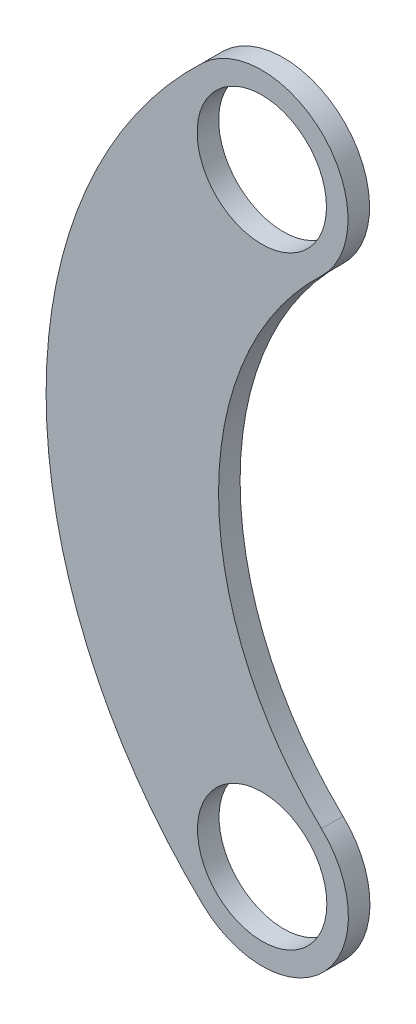
ISO-10303-21;
HEADER;
FILE_DESCRIPTION(('STEP AP214'),'2;1');
FILE_NAME('part.step','',(''),(''),'','','');
FILE_SCHEMA(('AUTOMOTIVE_DESIGN { 1 0 10303 214 1 1 1 1 }'));
ENDSEC;
DATA;
#1=APPLICATION_CONTEXT('core data for automotive mechanical design processes');
#2=APPLICATION_PROTOCOL_DEFINITION('international standard','automotive_design',2000,#1);
#3=PRODUCT_CONTEXT('',#1,'mechanical');
#4=PRODUCT('Part','Part','',(#3));
#5=PRODUCT_RELATED_PRODUCT_CATEGORY('part','',(#4));
#6=PRODUCT_DEFINITION_FORMATION('','',#4);
#7=PRODUCT_DEFINITION_CONTEXT('part definition',#1,'design');
#8=PRODUCT_DEFINITION('design','',#6,#7);
#9=PRODUCT_DEFINITION_SHAPE('','',#8);
#10=(LENGTH_UNIT() NAMED_UNIT(*) SI_UNIT(.MILLI.,.METRE.));
#11=(NAMED_UNIT(*) PLANE_ANGLE_UNIT() SI_UNIT($,.RADIAN.));
#12=(NAMED_UNIT(*) SI_UNIT($,.STERADIAN.) SOLID_ANGLE_UNIT());
#13=UNCERTAINTY_MEASURE_WITH_UNIT(LENGTH_MEASURE(1.E-05),#10,'distance_accuracy_value','');
#14=(GEOMETRIC_REPRESENTATION_CONTEXT(3) GLOBAL_UNCERTAINTY_ASSIGNED_CONTEXT((#13)) GLOBAL_UNIT_ASSIGNED_CONTEXT((#10,
#11,#12)) REPRESENTATION_CONTEXT('',''));
#15=CARTESIAN_POINT('',(0.,0.,0.));
#16=DIRECTION('',(0.,0.,1.));
#17=DIRECTION('',(1.,0.,0.));
#18=AXIS2_PLACEMENT_3D('',#15,#16,#17);
#19=CARTESIAN_POINT('',(-31.7651022120724,-5.87017847864853,-1.));
#20=DIRECTION('',(0.,0.,1.));
#21=DIRECTION('',(1.,0.,0.));
#22=AXIS2_PLACEMENT_3D('',#19,#20,#21);
#23=CYLINDRICAL_SURFACE('',#22,4.);
#24=CARTESIAN_POINT('',(-31.7651022120724,-5.87017847864853,0.));
#25=DIRECTION('',(0.,0.,1.));
#26=DIRECTION('',(1.,0.,0.));
#27=AXIS2_PLACEMENT_3D('',#24,#25,#26);
#28=CIRCLE('',#27,4.);
#29=CARTESIAN_POINT('',(-29.0099737146953,-8.77005209019454,0.));
#30=VERTEX_POINT('',#29);
#31=CARTESIAN_POINT('',(-34.5202307094494,-2.97030486710253,0.));
#32=VERTEX_POINT('',#31);
#33=EDGE_CURVE('E104',#30,#32,#28,.T.);
#34=ORIENTED_EDGE('',*,*,#33,.F.);
#35=DIRECTION('',(0.,0.,1.));
#36=VECTOR('',#35,1.);
#37=CARTESIAN_POINT('',(-29.0099737146953,-8.77005209019454,-1.));
#38=LINE('',#37,#36);
#39=CARTESIAN_POINT('',(-29.0099737146953,-8.77005209019454,-1.));
#40=VERTEX_POINT('',#39);
#41=EDGE_CURVE('E11',#40,#30,#38,.T.);
#42=ORIENTED_EDGE('',*,*,#41,.F.);
#43=CARTESIAN_POINT('',(-31.7651022120724,-5.87017847864853,-1.));
#44=DIRECTION('',(0.,0.,1.));
#45=DIRECTION('',(1.,0.,0.));
#46=AXIS2_PLACEMENT_3D('',#43,#44,#45);
#47=CIRCLE('',#46,4.);
#48=CARTESIAN_POINT('',(-34.5202307094494,-2.97030486710253,-1.));
#49=VERTEX_POINT('',#48);
#50=EDGE_CURVE('E97',#40,#49,#47,.T.);
#51=ORIENTED_EDGE('',*,*,#50,.T.);
#52=DIRECTION('',(0.,0.,1.));
#53=VECTOR('',#52,1.);
#54=CARTESIAN_POINT('',(-34.5202307094494,-2.97030486710253,-1.));
#55=LINE('',#54,#53);
#56=EDGE_CURVE('E42',#49,#32,#55,.T.);
#57=ORIENTED_EDGE('',*,*,#56,.T.);
#58=EDGE_LOOP('',(#34,#42,#51,#57));
#59=FACE_BOUND('',#58,.T.);
#60=ADVANCED_FACE('F39',(#59),#23,.T.);
#61=CARTESIAN_POINT('',(-18.4716072122281,-19.862068654358,-1.));
#62=DIRECTION('',(0.,0.,1.));
#63=DIRECTION('',(1.,0.,0.));
#64=AXIS2_PLACEMENT_3D('',#61,#62,#63);
#65=CYLINDRICAL_SURFACE('',#64,15.3);
#66=CARTESIAN_POINT('',(-18.4716072122281,-19.862068654358,0.));
#67=DIRECTION('',(0.,0.,-1.));
#68=DIRECTION('',(1.,0.,0.));
#69=AXIS2_PLACEMENT_3D('',#66,#67,#68);
#70=CIRCLE('',#69,15.3);
#71=CARTESIAN_POINT('',(-28.9964279377155,-30.9669391487109,0.));
#72=VERTEX_POINT('',#71);
#73=EDGE_CURVE('E99',#72,#30,#70,.T.);
#74=ORIENTED_EDGE('',*,*,#73,.F.);
#75=DIRECTION('',(0.,0.,1.));
#76=VECTOR('',#75,1.);
#77=CARTESIAN_POINT('',(-28.9964279377155,-30.9669391487109,-1.));
#78=LINE('',#77,#76);
#79=CARTESIAN_POINT('',(-28.9964279377155,-30.9669391487109,-1.));
#80=VERTEX_POINT('',#79);
#81=EDGE_CURVE('E48',#80,#72,#78,.T.);
#82=ORIENTED_EDGE('',*,*,#81,.F.);
#83=CARTESIAN_POINT('',(-18.4716072122281,-19.862068654358,-1.));
#84=DIRECTION('',(0.,0.,-1.));
#85=DIRECTION('',(1.,0.,0.));
#86=AXIS2_PLACEMENT_3D('',#83,#84,#85);
#87=CIRCLE('',#86,15.3);
#88=EDGE_CURVE('E94',#80,#40,#87,.T.);
#89=ORIENTED_EDGE('',*,*,#88,.T.);
#90=ORIENTED_EDGE('',*,*,#41,.T.);
#91=EDGE_LOOP('',(#74,#82,#89,#90));
#92=FACE_BOUND('',#91,.T.);
#93=ADVANCED_FACE('F115',(#92),#65,.F.);
#94=CARTESIAN_POINT('',(-31.74801505549,-33.8701732648816,-1.));
#95=DIRECTION('',(0.,0.,1.));
#96=DIRECTION('',(1.,0.,0.));
#97=AXIS2_PLACEMENT_3D('',#94,#95,#96);
#98=CYLINDRICAL_SURFACE('',#97,4.00000000000001);
#99=CARTESIAN_POINT('',(-31.74801505549,-33.8701732648816,0.));
#100=DIRECTION('',(0.,0.,1.));
#101=DIRECTION('',(1.,0.,0.));
#102=AXIS2_PLACEMENT_3D('',#99,#100,#101);
#103=CIRCLE('',#102,4.00000000000001);
#104=CARTESIAN_POINT('',(-34.4996021732645,-36.7734073810523,0.));
#105=VERTEX_POINT('',#104);
#106=EDGE_CURVE('E89',#105,#72,#103,.T.);
#107=ORIENTED_EDGE('',*,*,#106,.F.);
#108=DIRECTION('',(0.,0.,1.));
#109=VECTOR('',#108,1.);
#110=CARTESIAN_POINT('',(-34.4996021732645,-36.7734073810523,-1.));
#111=LINE('',#110,#109);
#112=CARTESIAN_POINT('',(-34.4996021732645,-36.7734073810523,-1.));
#113=VERTEX_POINT('',#112);
#114=EDGE_CURVE('E84',#113,#105,#111,.T.);
#115=ORIENTED_EDGE('',*,*,#114,.F.);
#116=CARTESIAN_POINT('',(-31.74801505549,-33.8701732648816,-1.));
#117=DIRECTION('',(0.,0.,1.));
#118=DIRECTION('',(1.,0.,0.));
#119=AXIS2_PLACEMENT_3D('',#116,#117,#118);
#120=CIRCLE('',#119,4.00000000000001);
#121=EDGE_CURVE('E87',#113,#80,#120,.T.);
#122=ORIENTED_EDGE('',*,*,#121,.T.);
#123=ORIENTED_EDGE('',*,*,#81,.T.);
#124=EDGE_LOOP('',(#107,#115,#122,#123));
#125=FACE_BOUND('',#124,.T.);
#126=ADVANCED_FACE('F86',(#125),#98,.T.);
#127=CARTESIAN_POINT('',(-18.4716072122281,-19.862068654358,-1.));
#128=DIRECTION('',(0.,0.,1.));
#129=DIRECTION('',(1.,0.,0.));
#130=AXIS2_PLACEMENT_3D('',#127,#128,#129);
#131=CYLINDRICAL_SURFACE('',#130,23.3);
#132=CARTESIAN_POINT('',(-18.4716072122281,-19.862068654358,0.));
#133=DIRECTION('',(0.,0.,1.));
#134=DIRECTION('',(1.,0.,0.));
#135=AXIS2_PLACEMENT_3D('',#132,#133,#134);
#136=CIRCLE('',#135,23.3);
#137=EDGE_CURVE('E107',#32,#105,#136,.T.);
#138=ORIENTED_EDGE('',*,*,#137,.F.);
#139=ORIENTED_EDGE('',*,*,#56,.F.);
#140=CARTESIAN_POINT('',(-18.4716072122281,-19.862068654358,-1.));
#141=DIRECTION('',(0.,0.,1.));
#142=DIRECTION('',(1.,0.,0.));
#143=AXIS2_PLACEMENT_3D('',#140,#141,#142);
#144=CIRCLE('',#143,23.3);
#145=EDGE_CURVE('E93',#49,#113,#144,.T.);
#146=ORIENTED_EDGE('',*,*,#145,.T.);
#147=ORIENTED_EDGE('',*,*,#114,.T.);
#148=EDGE_LOOP('',(#138,#139,#146,#147));
#149=FACE_BOUND('',#148,.T.);
#150=ADVANCED_FACE('F96',(#149),#131,.T.);
#151=CARTESIAN_POINT('',(-25.1183547121502,-12.8661235665033,-1.));
#152=DIRECTION('',(0.,0.,1.));
#153=DIRECTION('',(1.,0.,0.));
#154=AXIS2_PLACEMENT_3D('',#151,#152,#153);
#155=PLANE('',#154);
#156=CARTESIAN_POINT('',(-31.7651022120724,-5.87017847864853,-1.));
#157=DIRECTION('',(0.,0.,1.));
#158=DIRECTION('',(1.,0.,0.));
#159=AXIS2_PLACEMENT_3D('',#156,#157,#158);
#160=CIRCLE('',#159,3.00000000000001);
#161=CARTESIAN_POINT('',(-28.7651022120724,-5.87017847864853,-1.));
#162=VERTEX_POINT('',#161);
#163=EDGE_CURVE('E148',#162,#162,#160,.T.);
#164=ORIENTED_EDGE('',*,*,#163,.T.);
#165=EDGE_LOOP('',(#164));
#166=FACE_BOUND('',#165,.T.);
#167=CARTESIAN_POINT('',(-31.74801505549,-33.8701732648816,-1.));
#168=DIRECTION('',(0.,0.,1.));
#169=DIRECTION('',(1.,0.,0.));
#170=AXIS2_PLACEMENT_3D('',#167,#168,#169);
#171=CIRCLE('',#170,3.00000000000001);
#172=CARTESIAN_POINT('',(-28.74801505549,-33.8701732648816,-1.));
#173=VERTEX_POINT('',#172);
#174=EDGE_CURVE('E108',#173,#173,#171,.T.);
#175=ORIENTED_EDGE('',*,*,#174,.T.);
#176=EDGE_LOOP('',(#175));
#177=FACE_BOUND('',#176,.T.);
#178=ORIENTED_EDGE('',*,*,#50,.F.);
#179=ORIENTED_EDGE('',*,*,#88,.F.);
#180=ORIENTED_EDGE('',*,*,#121,.F.);
#181=ORIENTED_EDGE('',*,*,#145,.F.);
#182=EDGE_LOOP('',(#178,#179,#180,#181));
#183=FACE_BOUND('',#182,.T.);
#184=ADVANCED_FACE('F92',(#166,#177,#183),#155,.F.);
#185=CARTESIAN_POINT('',(-25.1183547121502,-12.8661235665033,0.));
#186=DIRECTION('',(0.,0.,1.));
#187=DIRECTION('',(1.,0.,0.));
#188=AXIS2_PLACEMENT_3D('',#185,#186,#187);
#189=PLANE('',#188);
#190=CARTESIAN_POINT('',(-31.7651022120724,-5.87017847864853,0.));
#191=DIRECTION('',(0.,0.,1.));
#192=DIRECTION('',(1.,0.,0.));
#193=AXIS2_PLACEMENT_3D('',#190,#191,#192);
#194=CIRCLE('',#193,3.00000000000001);
#195=CARTESIAN_POINT('',(-28.7651022120724,-5.87017847864853,0.));
#196=VERTEX_POINT('',#195);
#197=EDGE_CURVE('E151',#196,#196,#194,.T.);
#198=ORIENTED_EDGE('',*,*,#197,.F.);
#199=EDGE_LOOP('',(#198));
#200=FACE_BOUND('',#199,.T.);
#201=CARTESIAN_POINT('',(-31.74801505549,-33.8701732648816,0.));
#202=DIRECTION('',(0.,0.,1.));
#203=DIRECTION('',(1.,0.,0.));
#204=AXIS2_PLACEMENT_3D('',#201,#202,#203);
#205=CIRCLE('',#204,3.00000000000001);
#206=CARTESIAN_POINT('',(-28.74801505549,-33.8701732648816,0.));
#207=VERTEX_POINT('',#206);
#208=EDGE_CURVE('E153',#207,#207,#205,.T.);
#209=ORIENTED_EDGE('',*,*,#208,.F.);
#210=EDGE_LOOP('',(#209));
#211=FACE_BOUND('',#210,.T.);
#212=ORIENTED_EDGE('',*,*,#33,.T.);
#213=ORIENTED_EDGE('',*,*,#137,.T.);
#214=ORIENTED_EDGE('',*,*,#106,.T.);
#215=ORIENTED_EDGE('',*,*,#73,.T.);
#216=EDGE_LOOP('',(#212,#213,#214,#215));
#217=FACE_BOUND('',#216,.T.);
#218=ADVANCED_FACE('F114',(#200,#211,#217),#189,.T.);
#219=CARTESIAN_POINT('',(-31.74801505549,-33.8701732648816,-1.));
#220=DIRECTION('',(0.,0.,1.));
#221=DIRECTION('',(1.,0.,0.));
#222=AXIS2_PLACEMENT_3D('',#219,#220,#221);
#223=CYLINDRICAL_SURFACE('',#222,3.00000000000001);
#224=ORIENTED_EDGE('',*,*,#174,.F.);
#225=EDGE_LOOP('',(#224));
#226=FACE_BOUND('',#225,.T.);
#227=ORIENTED_EDGE('',*,*,#208,.T.);
#228=EDGE_LOOP('',(#227));
#229=FACE_BOUND('',#228,.T.);
#230=ADVANCED_FACE('F133',(#226,#229),#223,.F.);
#231=CARTESIAN_POINT('',(-31.7651022120724,-5.87017847864853,-1.));
#232=DIRECTION('',(0.,0.,1.));
#233=DIRECTION('',(1.,0.,0.));
#234=AXIS2_PLACEMENT_3D('',#231,#232,#233);
#235=CYLINDRICAL_SURFACE('',#234,3.00000000000001);
#236=ORIENTED_EDGE('',*,*,#163,.F.);
#237=EDGE_LOOP('',(#236));
#238=FACE_BOUND('',#237,.T.);
#239=ORIENTED_EDGE('',*,*,#197,.T.);
#240=EDGE_LOOP('',(#239));
#241=FACE_BOUND('',#240,.T.);
#242=ADVANCED_FACE('F140',(#238,#241),#235,.F.);
#243=CLOSED_SHELL('',(#60,#93,#126,#150,#184,#218,#230,#242));
#244=MANIFOLD_SOLID_BREP('B2',#243);
#245=ADVANCED_BREP_SHAPE_REPRESENTATION('',(#18,#244),#14);
#246=SHAPE_DEFINITION_REPRESENTATION(#9,#245);
ENDSEC;
END-ISO-10303-21;
